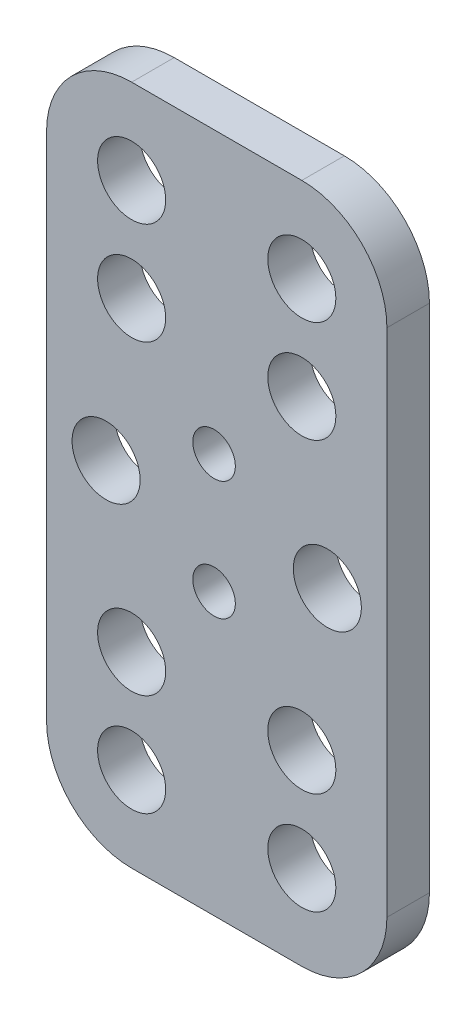
ISO-10303-21;
HEADER;
FILE_DESCRIPTION(('STEP AP214'),'2;1');
FILE_NAME('part.step','',(''),(''),'','','');
FILE_SCHEMA(('AUTOMOTIVE_DESIGN { 1 0 10303 214 1 1 1 1 }'));
ENDSEC;
DATA;
#1=APPLICATION_CONTEXT('core data for automotive mechanical design processes');
#2=APPLICATION_PROTOCOL_DEFINITION('international standard','automotive_design',2000,#1);
#3=PRODUCT_CONTEXT('',#1,'mechanical');
#4=PRODUCT('Part','Part','',(#3));
#5=PRODUCT_RELATED_PRODUCT_CATEGORY('part','',(#4));
#6=PRODUCT_DEFINITION_FORMATION('','',#4);
#7=PRODUCT_DEFINITION_CONTEXT('part definition',#1,'design');
#8=PRODUCT_DEFINITION('design','',#6,#7);
#9=PRODUCT_DEFINITION_SHAPE('','',#8);
#10=(LENGTH_UNIT() NAMED_UNIT(*) SI_UNIT(.MILLI.,.METRE.));
#11=(NAMED_UNIT(*) PLANE_ANGLE_UNIT() SI_UNIT($,.RADIAN.));
#12=(NAMED_UNIT(*) SI_UNIT($,.STERADIAN.) SOLID_ANGLE_UNIT());
#13=UNCERTAINTY_MEASURE_WITH_UNIT(LENGTH_MEASURE(1.E-05),#10,'distance_accuracy_value','');
#14=(GEOMETRIC_REPRESENTATION_CONTEXT(3) GLOBAL_UNCERTAINTY_ASSIGNED_CONTEXT((#13)) GLOBAL_UNIT_ASSIGNED_CONTEXT((#10,
#11,#12)) REPRESENTATION_CONTEXT('',''));
#15=CARTESIAN_POINT('',(0.,0.,0.));
#16=DIRECTION('',(0.,0.,1.));
#17=DIRECTION('',(1.,0.,0.));
#18=AXIS2_PLACEMENT_3D('',#15,#16,#17);
#19=CARTESIAN_POINT('',(10.3114632552883,-30.,5.));
#20=DIRECTION('',(0.,0.,1.));
#21=DIRECTION('',(1.,0.,0.));
#22=AXIS2_PLACEMENT_3D('',#19,#20,#21);
#23=PLANE('',#22);
#24=CARTESIAN_POINT('',(10.3114632552883,18.,5.));
#25=DIRECTION('',(0.,0.,1.));
#26=DIRECTION('',(1.,0.,0.));
#27=AXIS2_PLACEMENT_3D('',#24,#25,#26);
#28=CIRCLE('',#27,4.);
#29=CARTESIAN_POINT('',(14.3114632552883,18.,5.));
#30=VERTEX_POINT('',#29);
#31=EDGE_CURVE('E235',#30,#30,#28,.T.);
#32=ORIENTED_EDGE('',*,*,#31,.F.);
#33=EDGE_LOOP('',(#32));
#34=FACE_BOUND('',#33,.T.);
#35=CARTESIAN_POINT('',(-9.68853674471171,-18.,5.));
#36=DIRECTION('',(0.,0.,1.));
#37=DIRECTION('',(1.,0.,0.));
#38=AXIS2_PLACEMENT_3D('',#35,#36,#37);
#39=CIRCLE('',#38,4.);
#40=CARTESIAN_POINT('',(-5.68853674471171,-18.,5.));
#41=VERTEX_POINT('',#40);
#42=EDGE_CURVE('E223',#41,#41,#39,.T.);
#43=ORIENTED_EDGE('',*,*,#42,.F.);
#44=EDGE_LOOP('',(#43));
#45=FACE_BOUND('',#44,.T.);
#46=CARTESIAN_POINT('',(-12.6885367447117,0.,5.));
#47=DIRECTION('',(0.,0.,1.));
#48=DIRECTION('',(1.,0.,0.));
#49=AXIS2_PLACEMENT_3D('',#46,#47,#48);
#50=CIRCLE('',#49,4.);
#51=CARTESIAN_POINT('',(-8.68853674471171,0.,5.));
#52=VERTEX_POINT('',#51);
#53=EDGE_CURVE('E211',#52,#52,#50,.T.);
#54=ORIENTED_EDGE('',*,*,#53,.F.);
#55=EDGE_LOOP('',(#54));
#56=FACE_BOUND('',#55,.T.);
#57=CARTESIAN_POINT('',(-9.68853674471171,-30.,5.));
#58=DIRECTION('',(0.,0.,1.));
#59=DIRECTION('',(1.,0.,0.));
#60=AXIS2_PLACEMENT_3D('',#57,#58,#59);
#61=CIRCLE('',#60,4.);
#62=CARTESIAN_POINT('',(-5.68853674471171,-30.,5.));
#63=VERTEX_POINT('',#62);
#64=EDGE_CURVE('E199',#63,#63,#61,.T.);
#65=ORIENTED_EDGE('',*,*,#64,.F.);
#66=EDGE_LOOP('',(#65));
#67=FACE_BOUND('',#66,.T.);
#68=CARTESIAN_POINT('',(-9.68853674471171,30.,5.));
#69=DIRECTION('',(0.,0.,1.));
#70=DIRECTION('',(1.,0.,0.));
#71=AXIS2_PLACEMENT_3D('',#68,#69,#70);
#72=CIRCLE('',#71,4.);
#73=CARTESIAN_POINT('',(-5.68853674471171,30.,5.));
#74=VERTEX_POINT('',#73);
#75=EDGE_CURVE('E187',#74,#74,#72,.T.);
#76=ORIENTED_EDGE('',*,*,#75,.F.);
#77=EDGE_LOOP('',(#76));
#78=FACE_BOUND('',#77,.T.);
#79=CARTESIAN_POINT('',(0.,7.,5.));
#80=DIRECTION('',(0.,0.,1.));
#81=DIRECTION('',(1.,0.,0.));
#82=AXIS2_PLACEMENT_3D('',#79,#80,#81);
#83=CIRCLE('',#82,2.5);
#84=CARTESIAN_POINT('',(2.5,7.,5.));
#85=VERTEX_POINT('',#84);
#86=EDGE_CURVE('E133',#85,#85,#83,.T.);
#87=ORIENTED_EDGE('',*,*,#86,.F.);
#88=EDGE_LOOP('',(#87));
#89=FACE_BOUND('',#88,.T.);
#90=CARTESIAN_POINT('',(10.3114632552883,-30.,5.));
#91=DIRECTION('',(0.,0.,1.));
#92=DIRECTION('',(1.,0.,0.));
#93=AXIS2_PLACEMENT_3D('',#90,#91,#92);
#94=CIRCLE('',#93,10.);
#95=CARTESIAN_POINT('',(10.3114632552882,-40.,5.));
#96=VERTEX_POINT('',#95);
#97=CARTESIAN_POINT('',(20.3114632552883,-29.9999999999999,5.));
#98=VERTEX_POINT('',#97);
#99=EDGE_CURVE('E144',#96,#98,#94,.T.);
#100=ORIENTED_EDGE('',*,*,#99,.T.);
#101=DIRECTION('',(0.,1.,0.));
#102=VECTOR('',#101,1.);
#103=CARTESIAN_POINT('',(20.3114632552883,29.9999999999999,5.));
#104=LINE('',#103,#102);
#105=CARTESIAN_POINT('',(20.3114632552883,29.9999999999999,5.));
#106=VERTEX_POINT('',#105);
#107=EDGE_CURVE('E92',#98,#106,#104,.T.);
#108=ORIENTED_EDGE('',*,*,#107,.T.);
#109=CARTESIAN_POINT('',(10.3114632552883,30.,5.));
#110=DIRECTION('',(0.,0.,1.));
#111=DIRECTION('',(-1.,0.,0.));
#112=AXIS2_PLACEMENT_3D('',#109,#110,#111);
#113=CIRCLE('',#112,10.);
#114=CARTESIAN_POINT('',(10.3114632552882,40.,5.));
#115=VERTEX_POINT('',#114);
#116=EDGE_CURVE('E159',#106,#115,#113,.T.);
#117=ORIENTED_EDGE('',*,*,#116,.T.);
#118=DIRECTION('',(-1.,0.,0.));
#119=VECTOR('',#118,1.);
#120=CARTESIAN_POINT('',(-9.68853674471164,40.,5.));
#121=LINE('',#120,#119);
#122=CARTESIAN_POINT('',(-9.68853674471164,40.,5.));
#123=VERTEX_POINT('',#122);
#124=EDGE_CURVE('E172',#115,#123,#121,.T.);
#125=ORIENTED_EDGE('',*,*,#124,.T.);
#126=CARTESIAN_POINT('',(-9.68853674471171,30.,5.));
#127=DIRECTION('',(0.,0.,1.));
#128=DIRECTION('',(1.,0.,0.));
#129=AXIS2_PLACEMENT_3D('',#126,#127,#128);
#130=CIRCLE('',#129,10.);
#131=CARTESIAN_POINT('',(-19.6885367447117,29.9999999999999,5.));
#132=VERTEX_POINT('',#131);
#133=EDGE_CURVE('E111',#123,#132,#130,.T.);
#134=ORIENTED_EDGE('',*,*,#133,.T.);
#135=DIRECTION('',(0.,-1.,0.));
#136=VECTOR('',#135,1.);
#137=CARTESIAN_POINT('',(-19.6885367447117,29.9999999999999,5.));
#138=LINE('',#137,#136);
#139=CARTESIAN_POINT('',(-19.6885367447117,-29.9999999999999,5.));
#140=VERTEX_POINT('',#139);
#141=EDGE_CURVE('E105',#132,#140,#138,.T.);
#142=ORIENTED_EDGE('',*,*,#141,.T.);
#143=CARTESIAN_POINT('',(-9.6885367447117,-30.,5.));
#144=DIRECTION('',(0.,0.,1.));
#145=DIRECTION('',(1.,0.,0.));
#146=AXIS2_PLACEMENT_3D('',#143,#144,#145);
#147=CIRCLE('',#146,10.);
#148=CARTESIAN_POINT('',(-9.68853674471163,-40.,5.));
#149=VERTEX_POINT('',#148);
#150=EDGE_CURVE('E109',#140,#149,#147,.T.);
#151=ORIENTED_EDGE('',*,*,#150,.T.);
#152=DIRECTION('',(1.,0.,0.));
#153=VECTOR('',#152,1.);
#154=CARTESIAN_POINT('',(-9.68853674471163,-40.,5.));
#155=LINE('',#154,#153);
#156=EDGE_CURVE('E49',#149,#96,#155,.T.);
#157=ORIENTED_EDGE('',*,*,#156,.T.);
#158=EDGE_LOOP('',(#100,#108,#117,#125,#134,#142,#151,#157));
#159=FACE_BOUND('',#158,.T.);
#160=CARTESIAN_POINT('',(0.,-7.,5.));
#161=DIRECTION('',(0.,0.,1.));
#162=DIRECTION('',(1.,0.,0.));
#163=AXIS2_PLACEMENT_3D('',#160,#161,#162);
#164=CIRCLE('',#163,2.5);
#165=CARTESIAN_POINT('',(2.5,-7.,5.));
#166=VERTEX_POINT('',#165);
#167=EDGE_CURVE('E181',#166,#166,#164,.T.);
#168=ORIENTED_EDGE('',*,*,#167,.F.);
#169=EDGE_LOOP('',(#168));
#170=FACE_BOUND('',#169,.T.);
#171=CARTESIAN_POINT('',(10.3114632552883,30.,5.));
#172=DIRECTION('',(0.,0.,1.));
#173=DIRECTION('',(1.,0.,0.));
#174=AXIS2_PLACEMENT_3D('',#171,#172,#173);
#175=CIRCLE('',#174,4.);
#176=CARTESIAN_POINT('',(14.3114632552883,30.,5.));
#177=VERTEX_POINT('',#176);
#178=EDGE_CURVE('E193',#177,#177,#175,.T.);
#179=ORIENTED_EDGE('',*,*,#178,.F.);
#180=EDGE_LOOP('',(#179));
#181=FACE_BOUND('',#180,.T.);
#182=CARTESIAN_POINT('',(10.3114632552883,-30.,5.));
#183=DIRECTION('',(0.,0.,1.));
#184=DIRECTION('',(1.,0.,0.));
#185=AXIS2_PLACEMENT_3D('',#182,#183,#184);
#186=CIRCLE('',#185,4.);
#187=CARTESIAN_POINT('',(14.3114632552883,-30.,5.));
#188=VERTEX_POINT('',#187);
#189=EDGE_CURVE('E205',#188,#188,#186,.T.);
#190=ORIENTED_EDGE('',*,*,#189,.F.);
#191=EDGE_LOOP('',(#190));
#192=FACE_BOUND('',#191,.T.);
#193=CARTESIAN_POINT('',(13.3114632552883,0.,5.));
#194=DIRECTION('',(0.,0.,1.));
#195=DIRECTION('',(1.,0.,0.));
#196=AXIS2_PLACEMENT_3D('',#193,#194,#195);
#197=CIRCLE('',#196,4.);
#198=CARTESIAN_POINT('',(17.3114632552883,0.,5.));
#199=VERTEX_POINT('',#198);
#200=EDGE_CURVE('E217',#199,#199,#197,.T.);
#201=ORIENTED_EDGE('',*,*,#200,.F.);
#202=EDGE_LOOP('',(#201));
#203=FACE_BOUND('',#202,.T.);
#204=CARTESIAN_POINT('',(10.3114632552883,-18.,5.));
#205=DIRECTION('',(0.,0.,1.));
#206=DIRECTION('',(1.,0.,0.));
#207=AXIS2_PLACEMENT_3D('',#204,#205,#206);
#208=CIRCLE('',#207,4.);
#209=CARTESIAN_POINT('',(14.3114632552883,-18.,5.));
#210=VERTEX_POINT('',#209);
#211=EDGE_CURVE('E229',#210,#210,#208,.T.);
#212=ORIENTED_EDGE('',*,*,#211,.F.);
#213=EDGE_LOOP('',(#212));
#214=FACE_BOUND('',#213,.T.);
#215=CARTESIAN_POINT('',(-9.68853674471171,18.,5.));
#216=DIRECTION('',(0.,0.,1.));
#217=DIRECTION('',(1.,0.,0.));
#218=AXIS2_PLACEMENT_3D('',#215,#216,#217);
#219=CIRCLE('',#218,4.);
#220=CARTESIAN_POINT('',(-5.68853674471171,18.,5.));
#221=VERTEX_POINT('',#220);
#222=EDGE_CURVE('E241',#221,#221,#219,.T.);
#223=ORIENTED_EDGE('',*,*,#222,.F.);
#224=EDGE_LOOP('',(#223));
#225=FACE_BOUND('',#224,.T.);
#226=ADVANCED_FACE('F32',(#34,#45,#56,#67,#78,#89,#159,#170,#181,#192,#203,#214,#225),#23,.T.);
#227=CARTESIAN_POINT('',(10.3114632552883,-30.,0.));
#228=DIRECTION('',(0.,0.,1.));
#229=DIRECTION('',(1.,0.,0.));
#230=AXIS2_PLACEMENT_3D('',#227,#228,#229);
#231=PLANE('',#230);
#232=CARTESIAN_POINT('',(10.3114632552883,-30.,0.));
#233=DIRECTION('',(0.,0.,1.));
#234=DIRECTION('',(1.,0.,0.));
#235=AXIS2_PLACEMENT_3D('',#232,#233,#234);
#236=CIRCLE('',#235,10.);
#237=CARTESIAN_POINT('',(10.3114632552882,-40.,0.));
#238=VERTEX_POINT('',#237);
#239=CARTESIAN_POINT('',(20.3114632552883,-29.9999999999999,0.));
#240=VERTEX_POINT('',#239);
#241=EDGE_CURVE('E129',#238,#240,#236,.T.);
#242=ORIENTED_EDGE('',*,*,#241,.F.);
#243=DIRECTION('',(1.,0.,0.));
#244=VECTOR('',#243,1.);
#245=CARTESIAN_POINT('',(-9.68853674471163,-40.,0.));
#246=LINE('',#245,#244);
#247=CARTESIAN_POINT('',(-9.68853674471163,-40.,0.));
#248=VERTEX_POINT('',#247);
#249=EDGE_CURVE('E84',#248,#238,#246,.T.);
#250=ORIENTED_EDGE('',*,*,#249,.F.);
#251=CARTESIAN_POINT('',(-9.6885367447117,-30.,0.));
#252=DIRECTION('',(0.,0.,1.));
#253=DIRECTION('',(1.,0.,0.));
#254=AXIS2_PLACEMENT_3D('',#251,#252,#253);
#255=CIRCLE('',#254,10.);
#256=CARTESIAN_POINT('',(-19.6885367447117,-29.9999999999999,0.));
#257=VERTEX_POINT('',#256);
#258=EDGE_CURVE('E78',#257,#248,#255,.T.);
#259=ORIENTED_EDGE('',*,*,#258,.F.);
#260=DIRECTION('',(0.,-1.,0.));
#261=VECTOR('',#260,1.);
#262=CARTESIAN_POINT('',(-19.6885367447117,29.9999999999999,0.));
#263=LINE('',#262,#261);
#264=CARTESIAN_POINT('',(-19.6885367447117,29.9999999999999,0.));
#265=VERTEX_POINT('',#264);
#266=EDGE_CURVE('E119',#265,#257,#263,.T.);
#267=ORIENTED_EDGE('',*,*,#266,.F.);
#268=CARTESIAN_POINT('',(-9.68853674471171,30.,0.));
#269=DIRECTION('',(0.,0.,1.));
#270=DIRECTION('',(1.,0.,0.));
#271=AXIS2_PLACEMENT_3D('',#268,#269,#270);
#272=CIRCLE('',#271,10.);
#273=CARTESIAN_POINT('',(-9.68853674471164,40.,0.));
#274=VERTEX_POINT('',#273);
#275=EDGE_CURVE('E139',#274,#265,#272,.T.);
#276=ORIENTED_EDGE('',*,*,#275,.F.);
#277=DIRECTION('',(-1.,0.,0.));
#278=VECTOR('',#277,1.);
#279=CARTESIAN_POINT('',(-9.68853674471164,40.,0.));
#280=LINE('',#279,#278);
#281=CARTESIAN_POINT('',(10.3114632552882,40.,0.));
#282=VERTEX_POINT('',#281);
#283=EDGE_CURVE('E137',#282,#274,#280,.T.);
#284=ORIENTED_EDGE('',*,*,#283,.F.);
#285=CARTESIAN_POINT('',(10.3114632552883,30.,0.));
#286=DIRECTION('',(0.,0.,1.));
#287=DIRECTION('',(-1.,0.,0.));
#288=AXIS2_PLACEMENT_3D('',#285,#286,#287);
#289=CIRCLE('',#288,10.);
#290=CARTESIAN_POINT('',(20.3114632552883,29.9999999999999,0.));
#291=VERTEX_POINT('',#290);
#292=EDGE_CURVE('E135',#291,#282,#289,.T.);
#293=ORIENTED_EDGE('',*,*,#292,.F.);
#294=DIRECTION('',(0.,1.,0.));
#295=VECTOR('',#294,1.);
#296=CARTESIAN_POINT('',(20.3114632552883,29.9999999999999,0.));
#297=LINE('',#296,#295);
#298=EDGE_CURVE('E132',#240,#291,#297,.T.);
#299=ORIENTED_EDGE('',*,*,#298,.F.);
#300=EDGE_LOOP('',(#242,#250,#259,#267,#276,#284,#293,#299));
#301=FACE_BOUND('',#300,.T.);
#302=CARTESIAN_POINT('',(0.,7.,0.));
#303=DIRECTION('',(0.,0.,1.));
#304=DIRECTION('',(1.,0.,0.));
#305=AXIS2_PLACEMENT_3D('',#302,#303,#304);
#306=CIRCLE('',#305,2.5);
#307=CARTESIAN_POINT('',(2.5,7.,0.));
#308=VERTEX_POINT('',#307);
#309=EDGE_CURVE('E178',#308,#308,#306,.T.);
#310=ORIENTED_EDGE('',*,*,#309,.T.);
#311=EDGE_LOOP('',(#310));
#312=FACE_BOUND('',#311,.T.);
#313=CARTESIAN_POINT('',(0.,-7.,0.));
#314=DIRECTION('',(0.,0.,1.));
#315=DIRECTION('',(1.,0.,0.));
#316=AXIS2_PLACEMENT_3D('',#313,#314,#315);
#317=CIRCLE('',#316,2.5);
#318=CARTESIAN_POINT('',(2.5,-7.,0.));
#319=VERTEX_POINT('',#318);
#320=EDGE_CURVE('E184',#319,#319,#317,.T.);
#321=ORIENTED_EDGE('',*,*,#320,.T.);
#322=EDGE_LOOP('',(#321));
#323=FACE_BOUND('',#322,.T.);
#324=CARTESIAN_POINT('',(-9.68853674471171,30.,0.));
#325=DIRECTION('',(0.,0.,1.));
#326=DIRECTION('',(1.,0.,0.));
#327=AXIS2_PLACEMENT_3D('',#324,#325,#326);
#328=CIRCLE('',#327,4.);
#329=CARTESIAN_POINT('',(-5.68853674471171,30.,0.));
#330=VERTEX_POINT('',#329);
#331=EDGE_CURVE('E190',#330,#330,#328,.T.);
#332=ORIENTED_EDGE('',*,*,#331,.T.);
#333=EDGE_LOOP('',(#332));
#334=FACE_BOUND('',#333,.T.);
#335=CARTESIAN_POINT('',(10.3114632552883,30.,0.));
#336=DIRECTION('',(0.,0.,1.));
#337=DIRECTION('',(1.,0.,0.));
#338=AXIS2_PLACEMENT_3D('',#335,#336,#337);
#339=CIRCLE('',#338,4.);
#340=CARTESIAN_POINT('',(14.3114632552883,30.,0.));
#341=VERTEX_POINT('',#340);
#342=EDGE_CURVE('E196',#341,#341,#339,.T.);
#343=ORIENTED_EDGE('',*,*,#342,.T.);
#344=EDGE_LOOP('',(#343));
#345=FACE_BOUND('',#344,.T.);
#346=CARTESIAN_POINT('',(-9.68853674471171,-30.,0.));
#347=DIRECTION('',(0.,0.,1.));
#348=DIRECTION('',(1.,0.,0.));
#349=AXIS2_PLACEMENT_3D('',#346,#347,#348);
#350=CIRCLE('',#349,4.);
#351=CARTESIAN_POINT('',(-5.68853674471171,-30.,0.));
#352=VERTEX_POINT('',#351);
#353=EDGE_CURVE('E202',#352,#352,#350,.T.);
#354=ORIENTED_EDGE('',*,*,#353,.T.);
#355=EDGE_LOOP('',(#354));
#356=FACE_BOUND('',#355,.T.);
#357=CARTESIAN_POINT('',(10.3114632552883,-30.,0.));
#358=DIRECTION('',(0.,0.,1.));
#359=DIRECTION('',(1.,0.,0.));
#360=AXIS2_PLACEMENT_3D('',#357,#358,#359);
#361=CIRCLE('',#360,4.);
#362=CARTESIAN_POINT('',(14.3114632552883,-30.,0.));
#363=VERTEX_POINT('',#362);
#364=EDGE_CURVE('E208',#363,#363,#361,.T.);
#365=ORIENTED_EDGE('',*,*,#364,.T.);
#366=EDGE_LOOP('',(#365));
#367=FACE_BOUND('',#366,.T.);
#368=CARTESIAN_POINT('',(-12.6885367447117,0.,0.));
#369=DIRECTION('',(0.,0.,1.));
#370=DIRECTION('',(1.,0.,0.));
#371=AXIS2_PLACEMENT_3D('',#368,#369,#370);
#372=CIRCLE('',#371,4.);
#373=CARTESIAN_POINT('',(-8.68853674471171,0.,0.));
#374=VERTEX_POINT('',#373);
#375=EDGE_CURVE('E214',#374,#374,#372,.T.);
#376=ORIENTED_EDGE('',*,*,#375,.T.);
#377=EDGE_LOOP('',(#376));
#378=FACE_BOUND('',#377,.T.);
#379=CARTESIAN_POINT('',(13.3114632552883,0.,0.));
#380=DIRECTION('',(0.,0.,1.));
#381=DIRECTION('',(1.,0.,0.));
#382=AXIS2_PLACEMENT_3D('',#379,#380,#381);
#383=CIRCLE('',#382,4.);
#384=CARTESIAN_POINT('',(17.3114632552883,0.,0.));
#385=VERTEX_POINT('',#384);
#386=EDGE_CURVE('E220',#385,#385,#383,.T.);
#387=ORIENTED_EDGE('',*,*,#386,.T.);
#388=EDGE_LOOP('',(#387));
#389=FACE_BOUND('',#388,.T.);
#390=CARTESIAN_POINT('',(-9.68853674471171,-18.,0.));
#391=DIRECTION('',(0.,0.,1.));
#392=DIRECTION('',(1.,0.,0.));
#393=AXIS2_PLACEMENT_3D('',#390,#391,#392);
#394=CIRCLE('',#393,4.);
#395=CARTESIAN_POINT('',(-5.68853674471171,-18.,0.));
#396=VERTEX_POINT('',#395);
#397=EDGE_CURVE('E226',#396,#396,#394,.T.);
#398=ORIENTED_EDGE('',*,*,#397,.T.);
#399=EDGE_LOOP('',(#398));
#400=FACE_BOUND('',#399,.T.);
#401=CARTESIAN_POINT('',(10.3114632552883,-18.,0.));
#402=DIRECTION('',(0.,0.,1.));
#403=DIRECTION('',(1.,0.,0.));
#404=AXIS2_PLACEMENT_3D('',#401,#402,#403);
#405=CIRCLE('',#404,4.);
#406=CARTESIAN_POINT('',(14.3114632552883,-18.,0.));
#407=VERTEX_POINT('',#406);
#408=EDGE_CURVE('E232',#407,#407,#405,.T.);
#409=ORIENTED_EDGE('',*,*,#408,.T.);
#410=EDGE_LOOP('',(#409));
#411=FACE_BOUND('',#410,.T.);
#412=CARTESIAN_POINT('',(10.3114632552883,18.,0.));
#413=DIRECTION('',(0.,0.,1.));
#414=DIRECTION('',(1.,0.,0.));
#415=AXIS2_PLACEMENT_3D('',#412,#413,#414);
#416=CIRCLE('',#415,4.);
#417=CARTESIAN_POINT('',(14.3114632552883,18.,0.));
#418=VERTEX_POINT('',#417);
#419=EDGE_CURVE('E238',#418,#418,#416,.T.);
#420=ORIENTED_EDGE('',*,*,#419,.T.);
#421=EDGE_LOOP('',(#420));
#422=FACE_BOUND('',#421,.T.);
#423=CARTESIAN_POINT('',(-9.68853674471171,18.,0.));
#424=DIRECTION('',(0.,0.,1.));
#425=DIRECTION('',(1.,0.,0.));
#426=AXIS2_PLACEMENT_3D('',#423,#424,#425);
#427=CIRCLE('',#426,4.);
#428=CARTESIAN_POINT('',(-5.68853674471171,18.,0.));
#429=VERTEX_POINT('',#428);
#430=EDGE_CURVE('E244',#429,#429,#427,.T.);
#431=ORIENTED_EDGE('',*,*,#430,.T.);
#432=EDGE_LOOP('',(#431));
#433=FACE_BOUND('',#432,.T.);
#434=ADVANCED_FACE('F163',(#301,#312,#323,#334,#345,#356,#367,#378,#389,#400,#411,#422,#433),
#231,.F.);
#435=CARTESIAN_POINT('',(10.3114632552883,-30.,5.));
#436=DIRECTION('',(0.,0.,-1.));
#437=DIRECTION('',(-1.,0.,0.));
#438=AXIS2_PLACEMENT_3D('',#435,#436,#437);
#439=CYLINDRICAL_SURFACE('',#438,10.);
#440=ORIENTED_EDGE('',*,*,#241,.T.);
#441=DIRECTION('',(0.,0.,-1.));
#442=VECTOR('',#441,1.);
#443=CARTESIAN_POINT('',(20.3114632552883,-29.9999999999999,5.));
#444=LINE('',#443,#442);
#445=EDGE_CURVE('E11',#98,#240,#444,.T.);
#446=ORIENTED_EDGE('',*,*,#445,.F.);
#447=ORIENTED_EDGE('',*,*,#99,.F.);
#448=DIRECTION('',(0.,0.,-1.));
#449=VECTOR('',#448,1.);
#450=CARTESIAN_POINT('',(10.3114632552882,-40.,5.));
#451=LINE('',#450,#449);
#452=EDGE_CURVE('E125',#96,#238,#451,.T.);
#453=ORIENTED_EDGE('',*,*,#452,.T.);
#454=EDGE_LOOP('',(#440,#446,#447,#453));
#455=FACE_BOUND('',#454,.T.);
#456=ADVANCED_FACE('F34',(#455),#439,.T.);
#457=CARTESIAN_POINT('',(20.3114632552883,29.9999999999999,5.));
#458=DIRECTION('',(-1.,0.,0.));
#459=DIRECTION('',(0.,-1.,0.));
#460=AXIS2_PLACEMENT_3D('',#457,#458,#459);
#461=PLANE('',#460);
#462=ORIENTED_EDGE('',*,*,#298,.T.);
#463=DIRECTION('',(0.,0.,-1.));
#464=VECTOR('',#463,1.);
#465=CARTESIAN_POINT('',(20.3114632552883,29.9999999999999,5.));
#466=LINE('',#465,#464);
#467=EDGE_CURVE('E41',#106,#291,#466,.T.);
#468=ORIENTED_EDGE('',*,*,#467,.F.);
#469=ORIENTED_EDGE('',*,*,#107,.F.);
#470=ORIENTED_EDGE('',*,*,#445,.T.);
#471=EDGE_LOOP('',(#462,#468,#469,#470));
#472=FACE_BOUND('',#471,.T.);
#473=ADVANCED_FACE('F278',(#472),#461,.F.);
#474=CARTESIAN_POINT('',(10.3114632552883,30.,5.));
#475=DIRECTION('',(0.,0.,-1.));
#476=DIRECTION('',(-1.,0.,0.));
#477=AXIS2_PLACEMENT_3D('',#474,#475,#476);
#478=CYLINDRICAL_SURFACE('',#477,10.);
#479=ORIENTED_EDGE('',*,*,#292,.T.);
#480=DIRECTION('',(0.,0.,-1.));
#481=VECTOR('',#480,1.);
#482=CARTESIAN_POINT('',(10.3114632552882,40.,5.));
#483=LINE('',#482,#481);
#484=EDGE_CURVE('E151',#115,#282,#483,.T.);
#485=ORIENTED_EDGE('',*,*,#484,.F.);
#486=ORIENTED_EDGE('',*,*,#116,.F.);
#487=ORIENTED_EDGE('',*,*,#467,.T.);
#488=EDGE_LOOP('',(#479,#485,#486,#487));
#489=FACE_BOUND('',#488,.T.);
#490=ADVANCED_FACE('F157',(#489),#478,.T.);
#491=CARTESIAN_POINT('',(-9.68853674471164,40.,5.));
#492=DIRECTION('',(0.,-1.,0.));
#493=DIRECTION('',(1.,0.,0.));
#494=AXIS2_PLACEMENT_3D('',#491,#492,#493);
#495=PLANE('',#494);
#496=ORIENTED_EDGE('',*,*,#283,.T.);
#497=DIRECTION('',(0.,0.,-1.));
#498=VECTOR('',#497,1.);
#499=CARTESIAN_POINT('',(-9.68853674471164,40.,5.));
#500=LINE('',#499,#498);
#501=EDGE_CURVE('E148',#123,#274,#500,.T.);
#502=ORIENTED_EDGE('',*,*,#501,.F.);
#503=ORIENTED_EDGE('',*,*,#124,.F.);
#504=ORIENTED_EDGE('',*,*,#484,.T.);
#505=EDGE_LOOP('',(#496,#502,#503,#504));
#506=FACE_BOUND('',#505,.T.);
#507=ADVANCED_FACE('F168',(#506),#495,.F.);
#508=CARTESIAN_POINT('',(-9.68853674471171,30.,5.));
#509=DIRECTION('',(0.,0.,-1.));
#510=DIRECTION('',(-1.,0.,0.));
#511=AXIS2_PLACEMENT_3D('',#508,#509,#510);
#512=CYLINDRICAL_SURFACE('',#511,10.);
#513=ORIENTED_EDGE('',*,*,#275,.T.);
#514=DIRECTION('',(0.,0.,-1.));
#515=VECTOR('',#514,1.);
#516=CARTESIAN_POINT('',(-19.6885367447117,29.9999999999999,5.));
#517=LINE('',#516,#515);
#518=EDGE_CURVE('E120',#132,#265,#517,.T.);
#519=ORIENTED_EDGE('',*,*,#518,.F.);
#520=ORIENTED_EDGE('',*,*,#133,.F.);
#521=ORIENTED_EDGE('',*,*,#501,.T.);
#522=EDGE_LOOP('',(#513,#519,#520,#521));
#523=FACE_BOUND('',#522,.T.);
#524=ADVANCED_FACE('F171',(#523),#512,.T.);
#525=CARTESIAN_POINT('',(-19.6885367447117,29.9999999999999,5.));
#526=DIRECTION('',(1.,0.,0.));
#527=DIRECTION('',(0.,1.,0.));
#528=AXIS2_PLACEMENT_3D('',#525,#526,#527);
#529=PLANE('',#528);
#530=ORIENTED_EDGE('',*,*,#266,.T.);
#531=DIRECTION('',(0.,0.,-1.));
#532=VECTOR('',#531,1.);
#533=CARTESIAN_POINT('',(-19.6885367447117,-29.9999999999999,5.));
#534=LINE('',#533,#532);
#535=EDGE_CURVE('E116',#140,#257,#534,.T.);
#536=ORIENTED_EDGE('',*,*,#535,.F.);
#537=ORIENTED_EDGE('',*,*,#141,.F.);
#538=ORIENTED_EDGE('',*,*,#518,.T.);
#539=EDGE_LOOP('',(#530,#536,#537,#538));
#540=FACE_BOUND('',#539,.T.);
#541=ADVANCED_FACE('F117',(#540),#529,.F.);
#542=CARTESIAN_POINT('',(-9.6885367447117,-30.,5.));
#543=DIRECTION('',(0.,0.,-1.));
#544=DIRECTION('',(-1.,0.,0.));
#545=AXIS2_PLACEMENT_3D('',#542,#543,#544);
#546=CYLINDRICAL_SURFACE('',#545,10.);
#547=ORIENTED_EDGE('',*,*,#258,.T.);
#548=DIRECTION('',(0.,0.,-1.));
#549=VECTOR('',#548,1.);
#550=CARTESIAN_POINT('',(-9.68853674471163,-40.,5.));
#551=LINE('',#550,#549);
#552=EDGE_CURVE('E121',#149,#248,#551,.T.);
#553=ORIENTED_EDGE('',*,*,#552,.F.);
#554=ORIENTED_EDGE('',*,*,#150,.F.);
#555=ORIENTED_EDGE('',*,*,#535,.T.);
#556=EDGE_LOOP('',(#547,#553,#554,#555));
#557=FACE_BOUND('',#556,.T.);
#558=ADVANCED_FACE('F123',(#557),#546,.T.);
#559=CARTESIAN_POINT('',(-9.68853674471163,-40.,5.));
#560=DIRECTION('',(0.,1.,0.));
#561=DIRECTION('',(-1.,0.,0.));
#562=AXIS2_PLACEMENT_3D('',#559,#560,#561);
#563=PLANE('',#562);
#564=ORIENTED_EDGE('',*,*,#249,.T.);
#565=ORIENTED_EDGE('',*,*,#452,.F.);
#566=ORIENTED_EDGE('',*,*,#156,.F.);
#567=ORIENTED_EDGE('',*,*,#552,.T.);
#568=EDGE_LOOP('',(#564,#565,#566,#567));
#569=FACE_BOUND('',#568,.T.);
#570=ADVANCED_FACE('F266',(#569),#563,.F.);
#571=CARTESIAN_POINT('',(0.,7.,5.));
#572=DIRECTION('',(0.,0.,-1.));
#573=DIRECTION('',(-1.,0.,0.));
#574=AXIS2_PLACEMENT_3D('',#571,#572,#573);
#575=CYLINDRICAL_SURFACE('',#574,2.5);
#576=ORIENTED_EDGE('',*,*,#86,.T.);
#577=EDGE_LOOP('',(#576));
#578=FACE_BOUND('',#577,.T.);
#579=ORIENTED_EDGE('',*,*,#309,.F.);
#580=EDGE_LOOP('',(#579));
#581=FACE_BOUND('',#580,.T.);
#582=ADVANCED_FACE('F263',(#578,#581),#575,.F.);
#583=CARTESIAN_POINT('',(0.,-7.,5.));
#584=DIRECTION('',(0.,0.,-1.));
#585=DIRECTION('',(-1.,0.,0.));
#586=AXIS2_PLACEMENT_3D('',#583,#584,#585);
#587=CYLINDRICAL_SURFACE('',#586,2.5);
#588=ORIENTED_EDGE('',*,*,#167,.T.);
#589=EDGE_LOOP('',(#588));
#590=FACE_BOUND('',#589,.T.);
#591=ORIENTED_EDGE('',*,*,#320,.F.);
#592=EDGE_LOOP('',(#591));
#593=FACE_BOUND('',#592,.T.);
#594=ADVANCED_FACE('F342',(#590,#593),#587,.F.);
#595=CARTESIAN_POINT('',(-9.68853674471171,30.,5.));
#596=DIRECTION('',(0.,0.,-1.));
#597=DIRECTION('',(-1.,0.,0.));
#598=AXIS2_PLACEMENT_3D('',#595,#596,#597);
#599=CYLINDRICAL_SURFACE('',#598,4.);
#600=ORIENTED_EDGE('',*,*,#75,.T.);
#601=EDGE_LOOP('',(#600));
#602=FACE_BOUND('',#601,.T.);
#603=ORIENTED_EDGE('',*,*,#331,.F.);
#604=EDGE_LOOP('',(#603));
#605=FACE_BOUND('',#604,.T.);
#606=ADVANCED_FACE('F350',(#602,#605),#599,.F.);
#607=CARTESIAN_POINT('',(10.3114632552883,30.,5.));
#608=DIRECTION('',(0.,0.,-1.));
#609=DIRECTION('',(-1.,0.,0.));
#610=AXIS2_PLACEMENT_3D('',#607,#608,#609);
#611=CYLINDRICAL_SURFACE('',#610,4.);
#612=ORIENTED_EDGE('',*,*,#178,.T.);
#613=EDGE_LOOP('',(#612));
#614=FACE_BOUND('',#613,.T.);
#615=ORIENTED_EDGE('',*,*,#342,.F.);
#616=EDGE_LOOP('',(#615));
#617=FACE_BOUND('',#616,.T.);
#618=ADVANCED_FACE('F358',(#614,#617),#611,.F.);
#619=CARTESIAN_POINT('',(-9.68853674471171,-30.,5.));
#620=DIRECTION('',(0.,0.,-1.));
#621=DIRECTION('',(-1.,0.,0.));
#622=AXIS2_PLACEMENT_3D('',#619,#620,#621);
#623=CYLINDRICAL_SURFACE('',#622,4.);
#624=ORIENTED_EDGE('',*,*,#64,.T.);
#625=EDGE_LOOP('',(#624));
#626=FACE_BOUND('',#625,.T.);
#627=ORIENTED_EDGE('',*,*,#353,.F.);
#628=EDGE_LOOP('',(#627));
#629=FACE_BOUND('',#628,.T.);
#630=ADVANCED_FACE('F367',(#626,#629),#623,.F.);
#631=CARTESIAN_POINT('',(10.3114632552883,-30.,5.));
#632=DIRECTION('',(0.,0.,-1.));
#633=DIRECTION('',(-1.,0.,0.));
#634=AXIS2_PLACEMENT_3D('',#631,#632,#633);
#635=CYLINDRICAL_SURFACE('',#634,4.);
#636=ORIENTED_EDGE('',*,*,#189,.T.);
#637=EDGE_LOOP('',(#636));
#638=FACE_BOUND('',#637,.T.);
#639=ORIENTED_EDGE('',*,*,#364,.F.);
#640=EDGE_LOOP('',(#639));
#641=FACE_BOUND('',#640,.T.);
#642=ADVANCED_FACE('F376',(#638,#641),#635,.F.);
#643=CARTESIAN_POINT('',(-12.6885367447117,0.,5.));
#644=DIRECTION('',(0.,0.,-1.));
#645=DIRECTION('',(-1.,0.,0.));
#646=AXIS2_PLACEMENT_3D('',#643,#644,#645);
#647=CYLINDRICAL_SURFACE('',#646,4.);
#648=ORIENTED_EDGE('',*,*,#53,.T.);
#649=EDGE_LOOP('',(#648));
#650=FACE_BOUND('',#649,.T.);
#651=ORIENTED_EDGE('',*,*,#375,.F.);
#652=EDGE_LOOP('',(#651));
#653=FACE_BOUND('',#652,.T.);
#654=ADVANCED_FACE('F385',(#650,#653),#647,.F.);
#655=CARTESIAN_POINT('',(13.3114632552883,0.,5.));
#656=DIRECTION('',(0.,0.,-1.));
#657=DIRECTION('',(-1.,0.,0.));
#658=AXIS2_PLACEMENT_3D('',#655,#656,#657);
#659=CYLINDRICAL_SURFACE('',#658,4.);
#660=ORIENTED_EDGE('',*,*,#200,.T.);
#661=EDGE_LOOP('',(#660));
#662=FACE_BOUND('',#661,.T.);
#663=ORIENTED_EDGE('',*,*,#386,.F.);
#664=EDGE_LOOP('',(#663));
#665=FACE_BOUND('',#664,.T.);
#666=ADVANCED_FACE('F394',(#662,#665),#659,.F.);
#667=CARTESIAN_POINT('',(-9.68853674471171,-18.,5.));
#668=DIRECTION('',(0.,0.,-1.));
#669=DIRECTION('',(-1.,0.,0.));
#670=AXIS2_PLACEMENT_3D('',#667,#668,#669);
#671=CYLINDRICAL_SURFACE('',#670,4.);
#672=ORIENTED_EDGE('',*,*,#42,.T.);
#673=EDGE_LOOP('',(#672));
#674=FACE_BOUND('',#673,.T.);
#675=ORIENTED_EDGE('',*,*,#397,.F.);
#676=EDGE_LOOP('',(#675));
#677=FACE_BOUND('',#676,.T.);
#678=ADVANCED_FACE('F403',(#674,#677),#671,.F.);
#679=CARTESIAN_POINT('',(10.3114632552883,-18.,5.));
#680=DIRECTION('',(0.,0.,-1.));
#681=DIRECTION('',(-1.,0.,0.));
#682=AXIS2_PLACEMENT_3D('',#679,#680,#681);
#683=CYLINDRICAL_SURFACE('',#682,4.);
#684=ORIENTED_EDGE('',*,*,#211,.T.);
#685=EDGE_LOOP('',(#684));
#686=FACE_BOUND('',#685,.T.);
#687=ORIENTED_EDGE('',*,*,#408,.F.);
#688=EDGE_LOOP('',(#687));
#689=FACE_BOUND('',#688,.T.);
#690=ADVANCED_FACE('F412',(#686,#689),#683,.F.);
#691=CARTESIAN_POINT('',(10.3114632552883,18.,5.));
#692=DIRECTION('',(0.,0.,-1.));
#693=DIRECTION('',(-1.,0.,0.));
#694=AXIS2_PLACEMENT_3D('',#691,#692,#693);
#695=CYLINDRICAL_SURFACE('',#694,4.);
#696=ORIENTED_EDGE('',*,*,#31,.T.);
#697=EDGE_LOOP('',(#696));
#698=FACE_BOUND('',#697,.T.);
#699=ORIENTED_EDGE('',*,*,#419,.F.);
#700=EDGE_LOOP('',(#699));
#701=FACE_BOUND('',#700,.T.);
#702=ADVANCED_FACE('F421',(#698,#701),#695,.F.);
#703=CARTESIAN_POINT('',(-9.68853674471171,18.,5.));
#704=DIRECTION('',(0.,0.,-1.));
#705=DIRECTION('',(-1.,0.,0.));
#706=AXIS2_PLACEMENT_3D('',#703,#704,#705);
#707=CYLINDRICAL_SURFACE('',#706,4.);
#708=ORIENTED_EDGE('',*,*,#222,.T.);
#709=EDGE_LOOP('',(#708));
#710=FACE_BOUND('',#709,.T.);
#711=ORIENTED_EDGE('',*,*,#430,.F.);
#712=EDGE_LOOP('',(#711));
#713=FACE_BOUND('',#712,.T.);
#714=ADVANCED_FACE('F250',(#710,#713),#707,.F.);
#715=CLOSED_SHELL('',(#226,#434,#456,#473,#490,#507,#524,#541,#558,#570,#582,#594,#606,#618,
#630,#642,#654,#666,#678,#690,#702,#714));
#716=MANIFOLD_SOLID_BREP('B2',#715);
#717=ADVANCED_BREP_SHAPE_REPRESENTATION('',(#18,#716),#14);
#718=SHAPE_DEFINITION_REPRESENTATION(#9,#717);
ENDSEC;
END-ISO-10303-21;
